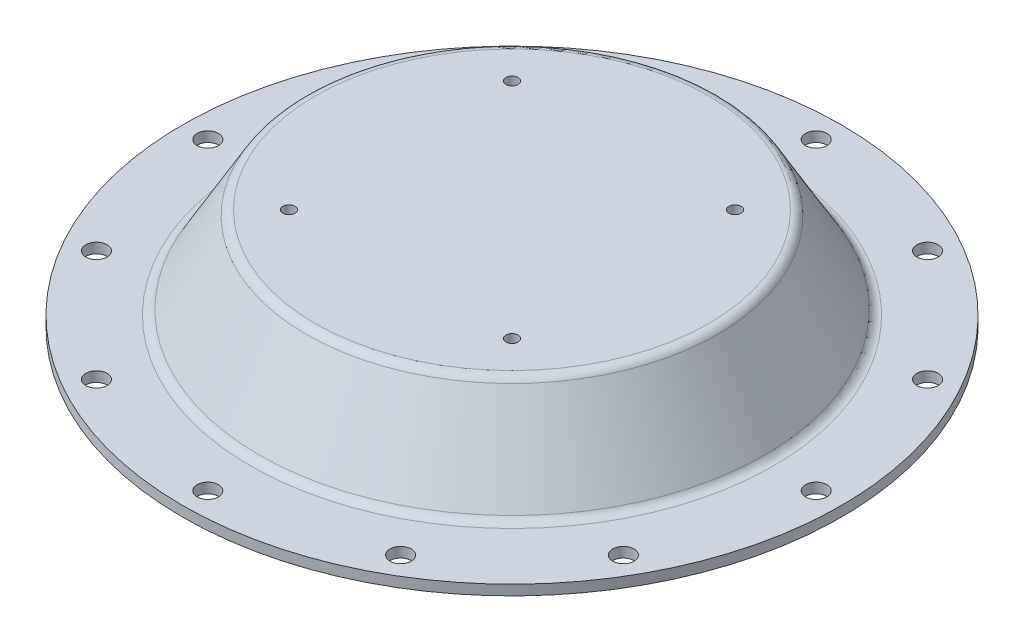
ISO-10303-21;
HEADER;
FILE_DESCRIPTION(('STEP AP214'),'2;1');
FILE_NAME('part.step','',(''),(''),'','','');
FILE_SCHEMA(('AUTOMOTIVE_DESIGN { 1 0 10303 214 1 1 1 1 }'));
ENDSEC;
DATA;
#1=APPLICATION_CONTEXT('core data for automotive mechanical design processes');
#2=APPLICATION_PROTOCOL_DEFINITION('international standard','automotive_design',2000,#1);
#3=PRODUCT_CONTEXT('',#1,'mechanical');
#4=PRODUCT('Part','Part','',(#3));
#5=PRODUCT_RELATED_PRODUCT_CATEGORY('part','',(#4));
#6=PRODUCT_DEFINITION_FORMATION('','',#4);
#7=PRODUCT_DEFINITION_CONTEXT('part definition',#1,'design');
#8=PRODUCT_DEFINITION('design','',#6,#7);
#9=PRODUCT_DEFINITION_SHAPE('','',#8);
#10=(LENGTH_UNIT() NAMED_UNIT(*) SI_UNIT(.MILLI.,.METRE.));
#11=(NAMED_UNIT(*) PLANE_ANGLE_UNIT() SI_UNIT($,.RADIAN.));
#12=(NAMED_UNIT(*) SI_UNIT($,.STERADIAN.) SOLID_ANGLE_UNIT());
#13=UNCERTAINTY_MEASURE_WITH_UNIT(LENGTH_MEASURE(1.E-05),#10,'distance_accuracy_value','');
#14=(GEOMETRIC_REPRESENTATION_CONTEXT(3) GLOBAL_UNCERTAINTY_ASSIGNED_CONTEXT((#13)) GLOBAL_UNIT_ASSIGNED_CONTEXT((#10,
#11,#12)) REPRESENTATION_CONTEXT('',''));
#15=CARTESIAN_POINT('',(0.,0.,0.));
#16=DIRECTION('',(0.,0.,1.));
#17=DIRECTION('',(1.,0.,0.));
#18=AXIS2_PLACEMENT_3D('',#15,#16,#17);
#19=CARTESIAN_POINT('',(0.,-90.,0.));
#20=DIRECTION('',(0.,-1.,0.));
#21=DIRECTION('',(0.,0.,-1.));
#22=AXIS2_PLACEMENT_3D('',#19,#20,#21);
#23=PLANE('',#22);
#24=CARTESIAN_POINT('',(-300.,-90.,0.));
#25=DIRECTION('',(0.,1.,0.));
#26=DIRECTION('',(0.,0.,1.));
#27=AXIS2_PLACEMENT_3D('',#24,#25,#26);
#28=CIRCLE('',#27,10.5);
#29=CARTESIAN_POINT('',(-300.,-90.,10.5));
#30=VERTEX_POINT('',#29);
#31=EDGE_CURVE('E142',#30,#30,#28,.T.);
#32=ORIENTED_EDGE('',*,*,#31,.F.);
#33=EDGE_LOOP('',(#32));
#34=FACE_BOUND('',#33,.T.);
#35=CARTESIAN_POINT('',(0.,-90.,0.));
#36=DIRECTION('',(0.,-1.,0.));
#37=DIRECTION('',(0.,0.,-1.));
#38=AXIS2_PLACEMENT_3D('',#35,#36,#37);
#39=CIRCLE('',#38,257.735026918963);
#40=CARTESIAN_POINT('',(0.,-90.,-257.735026918963));
#41=VERTEX_POINT('',#40);
#42=EDGE_CURVE('E48',#41,#41,#39,.T.);
#43=ORIENTED_EDGE('',*,*,#42,.T.);
#44=EDGE_LOOP('',(#43));
#45=FACE_BOUND('',#44,.T.);
#46=CARTESIAN_POINT('',(0.,-90.,0.));
#47=DIRECTION('',(0.,-1.,0.));
#48=DIRECTION('',(0.,0.,-1.));
#49=AXIS2_PLACEMENT_3D('',#46,#47,#48);
#50=CIRCLE('',#49,325.);
#51=CARTESIAN_POINT('',(0.,-90.,-325.));
#52=VERTEX_POINT('',#51);
#53=EDGE_CURVE('E73',#52,#52,#50,.T.);
#54=ORIENTED_EDGE('',*,*,#53,.F.);
#55=EDGE_LOOP('',(#54));
#56=FACE_BOUND('',#55,.T.);
#57=CARTESIAN_POINT('',(300.,-90.,0.));
#58=DIRECTION('',(0.,1.,0.));
#59=DIRECTION('',(0.,0.,1.));
#60=AXIS2_PLACEMENT_3D('',#57,#58,#59);
#61=CIRCLE('',#60,10.5);
#62=CARTESIAN_POINT('',(300.,-90.,10.5));
#63=VERTEX_POINT('',#62);
#64=EDGE_CURVE('E106',#63,#63,#61,.T.);
#65=ORIENTED_EDGE('',*,*,#64,.F.);
#66=EDGE_LOOP('',(#65));
#67=FACE_BOUND('',#66,.T.);
#68=CARTESIAN_POINT('',(259.807621135331,-90.,150.));
#69=DIRECTION('',(0.,1.,0.));
#70=DIRECTION('',(0.,0.,1.));
#71=AXIS2_PLACEMENT_3D('',#68,#69,#70);
#72=CIRCLE('',#71,10.5);
#73=CARTESIAN_POINT('',(259.807621135331,-90.,160.5));
#74=VERTEX_POINT('',#73);
#75=EDGE_CURVE('E112',#74,#74,#72,.T.);
#76=ORIENTED_EDGE('',*,*,#75,.F.);
#77=EDGE_LOOP('',(#76));
#78=FACE_BOUND('',#77,.T.);
#79=CARTESIAN_POINT('',(149.999999999999,-90.,259.807621135332));
#80=DIRECTION('',(0.,1.,0.));
#81=DIRECTION('',(0.,0.,1.));
#82=AXIS2_PLACEMENT_3D('',#79,#80,#81);
#83=CIRCLE('',#82,10.5);
#84=CARTESIAN_POINT('',(149.999999999999,-90.,270.307621135332));
#85=VERTEX_POINT('',#84);
#86=EDGE_CURVE('E118',#85,#85,#83,.T.);
#87=ORIENTED_EDGE('',*,*,#86,.F.);
#88=EDGE_LOOP('',(#87));
#89=FACE_BOUND('',#88,.T.);
#90=CARTESIAN_POINT('',(-1.04744440165294E-12,-90.,300.));
#91=DIRECTION('',(0.,1.,0.));
#92=DIRECTION('',(0.,0.,1.));
#93=AXIS2_PLACEMENT_3D('',#90,#91,#92);
#94=CIRCLE('',#93,10.5);
#95=CARTESIAN_POINT('',(-1.04744440165294E-12,-90.,310.5));
#96=VERTEX_POINT('',#95);
#97=EDGE_CURVE('E124',#96,#96,#94,.T.);
#98=ORIENTED_EDGE('',*,*,#97,.F.);
#99=EDGE_LOOP('',(#98));
#100=FACE_BOUND('',#99,.T.);
#101=CARTESIAN_POINT('',(-150.000000000001,-90.,259.807621135331));
#102=DIRECTION('',(0.,1.,0.));
#103=DIRECTION('',(0.,0.,1.));
#104=AXIS2_PLACEMENT_3D('',#101,#102,#103);
#105=CIRCLE('',#104,10.5);
#106=CARTESIAN_POINT('',(-150.000000000001,-90.,270.307621135331));
#107=VERTEX_POINT('',#106);
#108=EDGE_CURVE('E130',#107,#107,#105,.T.);
#109=ORIENTED_EDGE('',*,*,#108,.F.);
#110=EDGE_LOOP('',(#109));
#111=FACE_BOUND('',#110,.T.);
#112=CARTESIAN_POINT('',(-259.807621135332,-90.,149.999999999998));
#113=DIRECTION('',(0.,1.,0.));
#114=DIRECTION('',(0.,0.,1.));
#115=AXIS2_PLACEMENT_3D('',#112,#113,#114);
#116=CIRCLE('',#115,10.5);
#117=CARTESIAN_POINT('',(-259.807621135332,-90.,160.499999999998));
#118=VERTEX_POINT('',#117);
#119=EDGE_CURVE('E136',#118,#118,#116,.T.);
#120=ORIENTED_EDGE('',*,*,#119,.F.);
#121=EDGE_LOOP('',(#120));
#122=FACE_BOUND('',#121,.T.);
#123=CARTESIAN_POINT('',(-259.80762113533,-90.,-150.000000000002));
#124=DIRECTION('',(0.,1.,0.));
#125=DIRECTION('',(0.,0.,1.));
#126=AXIS2_PLACEMENT_3D('',#123,#124,#125);
#127=CIRCLE('',#126,10.5);
#128=CARTESIAN_POINT('',(-259.80762113533,-90.,-139.500000000002));
#129=VERTEX_POINT('',#128);
#130=EDGE_CURVE('E148',#129,#129,#127,.T.);
#131=ORIENTED_EDGE('',*,*,#130,.F.);
#132=EDGE_LOOP('',(#131));
#133=FACE_BOUND('',#132,.T.);
#134=CARTESIAN_POINT('',(-149.999999999998,-90.,-259.807621135333));
#135=DIRECTION('',(0.,1.,0.));
#136=DIRECTION('',(0.,0.,1.));
#137=AXIS2_PLACEMENT_3D('',#134,#135,#136);
#138=CIRCLE('',#137,10.5);
#139=CARTESIAN_POINT('',(-149.999999999998,-90.,-249.307621135333));
#140=VERTEX_POINT('',#139);
#141=EDGE_CURVE('E154',#140,#140,#138,.T.);
#142=ORIENTED_EDGE('',*,*,#141,.F.);
#143=EDGE_LOOP('',(#142));
#144=FACE_BOUND('',#143,.T.);
#145=CARTESIAN_POINT('',(3.14233320495882E-12,-90.,-300.));
#146=DIRECTION('',(0.,1.,0.));
#147=DIRECTION('',(0.,0.,1.));
#148=AXIS2_PLACEMENT_3D('',#145,#146,#147);
#149=CIRCLE('',#148,10.5);
#150=CARTESIAN_POINT('',(3.14233320495882E-12,-90.,-289.5));
#151=VERTEX_POINT('',#150);
#152=EDGE_CURVE('E160',#151,#151,#149,.T.);
#153=ORIENTED_EDGE('',*,*,#152,.F.);
#154=EDGE_LOOP('',(#153));
#155=FACE_BOUND('',#154,.T.);
#156=CARTESIAN_POINT('',(150.000000000003,-90.,-259.80762113533));
#157=DIRECTION('',(0.,1.,0.));
#158=DIRECTION('',(0.,0.,1.));
#159=AXIS2_PLACEMENT_3D('',#156,#157,#158);
#160=CIRCLE('',#159,10.5);
#161=CARTESIAN_POINT('',(150.000000000003,-90.,-249.30762113533));
#162=VERTEX_POINT('',#161);
#163=EDGE_CURVE('E166',#162,#162,#160,.T.);
#164=ORIENTED_EDGE('',*,*,#163,.F.);
#165=EDGE_LOOP('',(#164));
#166=FACE_BOUND('',#165,.T.);
#167=CARTESIAN_POINT('',(259.807621135334,-90.,-149.999999999997));
#168=DIRECTION('',(0.,1.,0.));
#169=DIRECTION('',(0.,0.,1.));
#170=AXIS2_PLACEMENT_3D('',#167,#168,#169);
#171=CIRCLE('',#170,10.5);
#172=CARTESIAN_POINT('',(259.807621135334,-90.,-139.499999999997));
#173=VERTEX_POINT('',#172);
#174=EDGE_CURVE('E172',#173,#173,#171,.T.);
#175=ORIENTED_EDGE('',*,*,#174,.F.);
#176=EDGE_LOOP('',(#175));
#177=FACE_BOUND('',#176,.T.);
#178=ADVANCED_FACE('F41',(#34,#45,#56,#67,#78,#89,#100,#111,#122,#133,#144,#155,#166,#177),#23,.F.);
#179=CARTESIAN_POINT('',(0.,0.,0.));
#180=DIRECTION('',(0.,-1.,0.));
#181=DIRECTION('',(0.,0.,1.));
#182=AXIS2_PLACEMENT_3D('',#179,#180,#181);
#183=CONICAL_SURFACE('',#182,200.,0.5235987755983);
#184=CARTESIAN_POINT('',(0.,-85.,0.));
#185=DIRECTION('',(0.,1.,0.));
#186=DIRECTION('',(0.,0.,1.));
#187=AXIS2_PLACEMENT_3D('',#184,#185,#186);
#188=CIRCLE('',#187,249.074772881118);
#189=CARTESIAN_POINT('',(0.,-85.,249.074772881118));
#190=VERTEX_POINT('',#189);
#191=EDGE_CURVE('E52',#190,#190,#188,.T.);
#192=ORIENTED_EDGE('',*,*,#191,.T.);
#193=EDGE_LOOP('',(#192));
#194=FACE_BOUND('',#193,.T.);
#195=CARTESIAN_POINT('',(0.,-5.,0.));
#196=DIRECTION('',(0.,1.,0.));
#197=DIRECTION('',(0.,0.,1.));
#198=AXIS2_PLACEMENT_3D('',#195,#196,#197);
#199=CIRCLE('',#198,202.886751345948);
#200=CARTESIAN_POINT('',(0.,-5.,202.886751345948));
#201=VERTEX_POINT('',#200);
#202=EDGE_CURVE('E56',#201,#201,#199,.F.);
#203=ORIENTED_EDGE('',*,*,#202,.T.);
#204=EDGE_LOOP('',(#203));
#205=FACE_BOUND('',#204,.T.);
#206=ADVANCED_FACE('F179',(#194,#205),#183,.T.);
#207=CARTESIAN_POINT('',(0.,0.,0.));
#208=DIRECTION('',(0.,1.,0.));
#209=DIRECTION('',(0.,0.,1.));
#210=AXIS2_PLACEMENT_3D('',#207,#208,#209);
#211=PLANE('',#210);
#212=CARTESIAN_POINT('',(110.,0.,-110.));
#213=DIRECTION('',(0.,1.,0.));
#214=DIRECTION('',(0.,0.,1.));
#215=AXIS2_PLACEMENT_3D('',#212,#213,#214);
#216=CIRCLE('',#215,5.99999999999998);
#217=CARTESIAN_POINT('',(110.,0.,-104.));
#218=VERTEX_POINT('',#217);
#219=EDGE_CURVE('E100',#218,#218,#216,.T.);
#220=ORIENTED_EDGE('',*,*,#219,.F.);
#221=EDGE_LOOP('',(#220));
#222=FACE_BOUND('',#221,.T.);
#223=CARTESIAN_POINT('',(-110.,0.,110.));
#224=DIRECTION('',(0.,1.,0.));
#225=DIRECTION('',(0.,0.,1.));
#226=AXIS2_PLACEMENT_3D('',#223,#224,#225);
#227=CIRCLE('',#226,5.99999999999998);
#228=CARTESIAN_POINT('',(-110.,0.,116.));
#229=VERTEX_POINT('',#228);
#230=EDGE_CURVE('E94',#229,#229,#227,.T.);
#231=ORIENTED_EDGE('',*,*,#230,.F.);
#232=EDGE_LOOP('',(#231));
#233=FACE_BOUND('',#232,.T.);
#234=CARTESIAN_POINT('',(-110.,0.,-110.));
#235=DIRECTION('',(0.,1.,0.));
#236=DIRECTION('',(0.,0.,1.));
#237=AXIS2_PLACEMENT_3D('',#234,#235,#236);
#238=CIRCLE('',#237,5.99999999999998);
#239=CARTESIAN_POINT('',(-110.,0.,-104.));
#240=VERTEX_POINT('',#239);
#241=EDGE_CURVE('E88',#240,#240,#238,.T.);
#242=ORIENTED_EDGE('',*,*,#241,.F.);
#243=EDGE_LOOP('',(#242));
#244=FACE_BOUND('',#243,.T.);
#245=CARTESIAN_POINT('',(110.,0.,110.));
#246=DIRECTION('',(0.,1.,0.));
#247=DIRECTION('',(0.,0.,1.));
#248=AXIS2_PLACEMENT_3D('',#245,#246,#247);
#249=CIRCLE('',#248,5.99999999999998);
#250=CARTESIAN_POINT('',(110.,0.,116.));
#251=VERTEX_POINT('',#250);
#252=EDGE_CURVE('E82',#251,#251,#249,.T.);
#253=ORIENTED_EDGE('',*,*,#252,.F.);
#254=EDGE_LOOP('',(#253));
#255=FACE_BOUND('',#254,.T.);
#256=CARTESIAN_POINT('',(0.,0.,0.));
#257=DIRECTION('',(0.,1.,0.));
#258=DIRECTION('',(0.,0.,1.));
#259=AXIS2_PLACEMENT_3D('',#256,#257,#258);
#260=CIRCLE('',#259,194.226497308104);
#261=CARTESIAN_POINT('',(0.,0.,194.226497308104));
#262=VERTEX_POINT('',#261);
#263=EDGE_CURVE('E10',#262,#262,#260,.T.);
#264=ORIENTED_EDGE('',*,*,#263,.T.);
#265=EDGE_LOOP('',(#264));
#266=FACE_BOUND('',#265,.T.);
#267=ADVANCED_FACE('F186',(#222,#233,#244,#255,#266),#211,.T.);
#268=CARTESIAN_POINT('',(0.,-90.,0.));
#269=DIRECTION('',(0.,-1.,0.));
#270=DIRECTION('',(0.,0.,-1.));
#271=AXIS2_PLACEMENT_3D('',#268,#269,#270);
#272=CYLINDRICAL_SURFACE('',#271,325.);
#273=ORIENTED_EDGE('',*,*,#53,.T.);
#274=EDGE_LOOP('',(#273));
#275=FACE_BOUND('',#274,.T.);
#276=CARTESIAN_POINT('',(0.,-100.,0.));
#277=DIRECTION('',(0.,-1.,0.));
#278=DIRECTION('',(0.,0.,-1.));
#279=AXIS2_PLACEMENT_3D('',#276,#277,#278);
#280=CIRCLE('',#279,325.);
#281=CARTESIAN_POINT('',(0.,-100.,-325.));
#282=VERTEX_POINT('',#281);
#283=EDGE_CURVE('E74',#282,#282,#280,.T.);
#284=ORIENTED_EDGE('',*,*,#283,.F.);
#285=EDGE_LOOP('',(#284));
#286=FACE_BOUND('',#285,.T.);
#287=ADVANCED_FACE('F194',(#275,#286),#272,.T.);
#288=CARTESIAN_POINT('',(0.,-100.,0.));
#289=DIRECTION('',(0.,1.,0.));
#290=DIRECTION('',(0.,0.,1.));
#291=AXIS2_PLACEMENT_3D('',#288,#289,#290);
#292=PLANE('',#291);
#293=CARTESIAN_POINT('',(259.807621135334,-100.,-149.999999999997));
#294=DIRECTION('',(0.,1.,0.));
#295=DIRECTION('',(0.,0.,1.));
#296=AXIS2_PLACEMENT_3D('',#293,#294,#295);
#297=CIRCLE('',#296,10.5);
#298=CARTESIAN_POINT('',(259.807621135334,-100.,-139.499999999997));
#299=VERTEX_POINT('',#298);
#300=EDGE_CURVE('E169',#299,#299,#297,.T.);
#301=ORIENTED_EDGE('',*,*,#300,.T.);
#302=EDGE_LOOP('',(#301));
#303=FACE_BOUND('',#302,.T.);
#304=CARTESIAN_POINT('',(150.000000000003,-100.,-259.80762113533));
#305=DIRECTION('',(0.,1.,0.));
#306=DIRECTION('',(0.,0.,1.));
#307=AXIS2_PLACEMENT_3D('',#304,#305,#306);
#308=CIRCLE('',#307,10.5);
#309=CARTESIAN_POINT('',(150.000000000003,-100.,-249.30762113533));
#310=VERTEX_POINT('',#309);
#311=EDGE_CURVE('E163',#310,#310,#308,.T.);
#312=ORIENTED_EDGE('',*,*,#311,.T.);
#313=EDGE_LOOP('',(#312));
#314=FACE_BOUND('',#313,.T.);
#315=CARTESIAN_POINT('',(3.14233320495882E-12,-100.,-300.));
#316=DIRECTION('',(0.,1.,0.));
#317=DIRECTION('',(0.,0.,1.));
#318=AXIS2_PLACEMENT_3D('',#315,#316,#317);
#319=CIRCLE('',#318,10.5);
#320=CARTESIAN_POINT('',(3.14233320495882E-12,-100.,-289.5));
#321=VERTEX_POINT('',#320);
#322=EDGE_CURVE('E157',#321,#321,#319,.T.);
#323=ORIENTED_EDGE('',*,*,#322,.T.);
#324=EDGE_LOOP('',(#323));
#325=FACE_BOUND('',#324,.T.);
#326=CARTESIAN_POINT('',(-149.999999999998,-100.,-259.807621135333));
#327=DIRECTION('',(0.,1.,0.));
#328=DIRECTION('',(0.,0.,1.));
#329=AXIS2_PLACEMENT_3D('',#326,#327,#328);
#330=CIRCLE('',#329,10.5);
#331=CARTESIAN_POINT('',(-149.999999999998,-100.,-249.307621135333));
#332=VERTEX_POINT('',#331);
#333=EDGE_CURVE('E151',#332,#332,#330,.T.);
#334=ORIENTED_EDGE('',*,*,#333,.T.);
#335=EDGE_LOOP('',(#334));
#336=FACE_BOUND('',#335,.T.);
#337=CARTESIAN_POINT('',(-259.80762113533,-100.,-150.000000000002));
#338=DIRECTION('',(0.,1.,0.));
#339=DIRECTION('',(0.,0.,1.));
#340=AXIS2_PLACEMENT_3D('',#337,#338,#339);
#341=CIRCLE('',#340,10.5);
#342=CARTESIAN_POINT('',(-259.80762113533,-100.,-139.500000000002));
#343=VERTEX_POINT('',#342);
#344=EDGE_CURVE('E145',#343,#343,#341,.T.);
#345=ORIENTED_EDGE('',*,*,#344,.T.);
#346=EDGE_LOOP('',(#345));
#347=FACE_BOUND('',#346,.T.);
#348=CARTESIAN_POINT('',(-300.,-100.,0.));
#349=DIRECTION('',(0.,1.,0.));
#350=DIRECTION('',(0.,0.,1.));
#351=AXIS2_PLACEMENT_3D('',#348,#349,#350);
#352=CIRCLE('',#351,10.5);
#353=CARTESIAN_POINT('',(-300.,-100.,10.5));
#354=VERTEX_POINT('',#353);
#355=EDGE_CURVE('E139',#354,#354,#352,.T.);
#356=ORIENTED_EDGE('',*,*,#355,.T.);
#357=EDGE_LOOP('',(#356));
#358=FACE_BOUND('',#357,.T.);
#359=CARTESIAN_POINT('',(-259.807621135332,-100.,149.999999999998));
#360=DIRECTION('',(0.,1.,0.));
#361=DIRECTION('',(0.,0.,1.));
#362=AXIS2_PLACEMENT_3D('',#359,#360,#361);
#363=CIRCLE('',#362,10.5);
#364=CARTESIAN_POINT('',(-259.807621135332,-100.,160.499999999998));
#365=VERTEX_POINT('',#364);
#366=EDGE_CURVE('E133',#365,#365,#363,.T.);
#367=ORIENTED_EDGE('',*,*,#366,.T.);
#368=EDGE_LOOP('',(#367));
#369=FACE_BOUND('',#368,.T.);
#370=CARTESIAN_POINT('',(-150.000000000001,-100.,259.807621135331));
#371=DIRECTION('',(0.,1.,0.));
#372=DIRECTION('',(0.,0.,1.));
#373=AXIS2_PLACEMENT_3D('',#370,#371,#372);
#374=CIRCLE('',#373,10.5);
#375=CARTESIAN_POINT('',(-150.000000000001,-100.,270.307621135331));
#376=VERTEX_POINT('',#375);
#377=EDGE_CURVE('E127',#376,#376,#374,.T.);
#378=ORIENTED_EDGE('',*,*,#377,.T.);
#379=EDGE_LOOP('',(#378));
#380=FACE_BOUND('',#379,.T.);
#381=CARTESIAN_POINT('',(-1.04744440165294E-12,-100.,300.));
#382=DIRECTION('',(0.,1.,0.));
#383=DIRECTION('',(0.,0.,1.));
#384=AXIS2_PLACEMENT_3D('',#381,#382,#383);
#385=CIRCLE('',#384,10.5);
#386=CARTESIAN_POINT('',(-1.04744440165294E-12,-100.,310.5));
#387=VERTEX_POINT('',#386);
#388=EDGE_CURVE('E121',#387,#387,#385,.T.);
#389=ORIENTED_EDGE('',*,*,#388,.T.);
#390=EDGE_LOOP('',(#389));
#391=FACE_BOUND('',#390,.T.);
#392=CARTESIAN_POINT('',(149.999999999999,-100.,259.807621135332));
#393=DIRECTION('',(0.,1.,0.));
#394=DIRECTION('',(0.,0.,1.));
#395=AXIS2_PLACEMENT_3D('',#392,#393,#394);
#396=CIRCLE('',#395,10.5);
#397=CARTESIAN_POINT('',(149.999999999999,-100.,270.307621135332));
#398=VERTEX_POINT('',#397);
#399=EDGE_CURVE('E115',#398,#398,#396,.T.);
#400=ORIENTED_EDGE('',*,*,#399,.T.);
#401=EDGE_LOOP('',(#400));
#402=FACE_BOUND('',#401,.T.);
#403=CARTESIAN_POINT('',(259.807621135331,-100.,150.));
#404=DIRECTION('',(0.,1.,0.));
#405=DIRECTION('',(0.,0.,1.));
#406=AXIS2_PLACEMENT_3D('',#403,#404,#405);
#407=CIRCLE('',#406,10.5);
#408=CARTESIAN_POINT('',(259.807621135331,-100.,160.5));
#409=VERTEX_POINT('',#408);
#410=EDGE_CURVE('E109',#409,#409,#407,.T.);
#411=ORIENTED_EDGE('',*,*,#410,.T.);
#412=EDGE_LOOP('',(#411));
#413=FACE_BOUND('',#412,.T.);
#414=CARTESIAN_POINT('',(300.,-100.,0.));
#415=DIRECTION('',(0.,1.,0.));
#416=DIRECTION('',(0.,0.,1.));
#417=AXIS2_PLACEMENT_3D('',#414,#415,#416);
#418=CIRCLE('',#417,10.5);
#419=CARTESIAN_POINT('',(300.,-100.,10.5));
#420=VERTEX_POINT('',#419);
#421=EDGE_CURVE('E103',#420,#420,#418,.T.);
#422=ORIENTED_EDGE('',*,*,#421,.T.);
#423=EDGE_LOOP('',(#422));
#424=FACE_BOUND('',#423,.T.);
#425=CARTESIAN_POINT('',(0.,-100.,0.));
#426=DIRECTION('',(0.,1.,0.));
#427=DIRECTION('',(0.,0.,1.));
#428=AXIS2_PLACEMENT_3D('',#425,#426,#427);
#429=CIRCLE('',#428,251.961524227066);
#430=CARTESIAN_POINT('',(0.,-100.,251.961524227066));
#431=VERTEX_POINT('',#430);
#432=EDGE_CURVE('E61',#431,#431,#429,.T.);
#433=ORIENTED_EDGE('',*,*,#432,.T.);
#434=EDGE_LOOP('',(#433));
#435=FACE_BOUND('',#434,.T.);
#436=ORIENTED_EDGE('',*,*,#283,.T.);
#437=EDGE_LOOP('',(#436));
#438=FACE_BOUND('',#437,.T.);
#439=ADVANCED_FACE('F197',(#303,#314,#325,#336,#347,#358,#369,#380,#391,#402,#413,#424,#435,
#438),#292,.F.);
#440=CARTESIAN_POINT('',(0.,-5.00000000000001,0.));
#441=DIRECTION('',(0.,-1.,0.));
#442=DIRECTION('',(0.,0.,1.));
#443=AXIS2_PLACEMENT_3D('',#440,#441,#442);
#444=CONICAL_SURFACE('',#443,191.339745962156,0.5235987755983);
#445=CARTESIAN_POINT('',(0.,-15.,0.));
#446=DIRECTION('',(0.,-1.,0.));
#447=DIRECTION('',(0.,0.,-1.));
#448=AXIS2_PLACEMENT_3D('',#445,#446,#447);
#449=CIRCLE('',#448,197.113248654052);
#450=CARTESIAN_POINT('',(0.,-15.,-197.113248654052));
#451=VERTEX_POINT('',#450);
#452=EDGE_CURVE('E67',#451,#451,#449,.F.);
#453=ORIENTED_EDGE('',*,*,#452,.T.);
#454=EDGE_LOOP('',(#453));
#455=FACE_BOUND('',#454,.T.);
#456=CARTESIAN_POINT('',(0.,-94.9999999999999,0.));
#457=DIRECTION('',(0.,1.,0.));
#458=DIRECTION('',(0.,0.,1.));
#459=AXIS2_PLACEMENT_3D('',#456,#457,#458);
#460=CIRCLE('',#459,243.301270189222);
#461=CARTESIAN_POINT('',(0.,-94.9999999999999,243.301270189222));
#462=VERTEX_POINT('',#461);
#463=EDGE_CURVE('E70',#462,#462,#460,.F.);
#464=ORIENTED_EDGE('',*,*,#463,.T.);
#465=EDGE_LOOP('',(#464));
#466=FACE_BOUND('',#465,.T.);
#467=ADVANCED_FACE('F201',(#455,#466),#444,.F.);
#468=CARTESIAN_POINT('',(0.,-10.,0.));
#469=DIRECTION('',(0.,1.,0.));
#470=DIRECTION('',(0.,0.,1.));
#471=AXIS2_PLACEMENT_3D('',#468,#469,#470);
#472=PLANE('',#471);
#473=CARTESIAN_POINT('',(110.,-9.99999999999999,-110.));
#474=DIRECTION('',(0.,1.,0.));
#475=DIRECTION('',(0.,0.,1.));
#476=AXIS2_PLACEMENT_3D('',#473,#474,#475);
#477=CIRCLE('',#476,5.99999999999998);
#478=CARTESIAN_POINT('',(110.,-9.99999999999999,-104.));
#479=VERTEX_POINT('',#478);
#480=EDGE_CURVE('E97',#479,#479,#477,.T.);
#481=ORIENTED_EDGE('',*,*,#480,.T.);
#482=EDGE_LOOP('',(#481));
#483=FACE_BOUND('',#482,.T.);
#484=CARTESIAN_POINT('',(-110.,-9.99999999999999,110.));
#485=DIRECTION('',(0.,1.,0.));
#486=DIRECTION('',(0.,0.,1.));
#487=AXIS2_PLACEMENT_3D('',#484,#485,#486);
#488=CIRCLE('',#487,5.99999999999998);
#489=CARTESIAN_POINT('',(-110.,-9.99999999999999,116.));
#490=VERTEX_POINT('',#489);
#491=EDGE_CURVE('E91',#490,#490,#488,.T.);
#492=ORIENTED_EDGE('',*,*,#491,.T.);
#493=EDGE_LOOP('',(#492));
#494=FACE_BOUND('',#493,.T.);
#495=CARTESIAN_POINT('',(-110.,-9.99999999999999,-110.));
#496=DIRECTION('',(0.,1.,0.));
#497=DIRECTION('',(0.,0.,1.));
#498=AXIS2_PLACEMENT_3D('',#495,#496,#497);
#499=CIRCLE('',#498,5.99999999999998);
#500=CARTESIAN_POINT('',(-110.,-9.99999999999999,-104.));
#501=VERTEX_POINT('',#500);
#502=EDGE_CURVE('E85',#501,#501,#499,.T.);
#503=ORIENTED_EDGE('',*,*,#502,.T.);
#504=EDGE_LOOP('',(#503));
#505=FACE_BOUND('',#504,.T.);
#506=CARTESIAN_POINT('',(110.,-9.99999999999999,110.));
#507=DIRECTION('',(0.,1.,0.));
#508=DIRECTION('',(0.,0.,1.));
#509=AXIS2_PLACEMENT_3D('',#506,#507,#508);
#510=CIRCLE('',#509,5.99999999999998);
#511=CARTESIAN_POINT('',(110.,-9.99999999999999,116.));
#512=VERTEX_POINT('',#511);
#513=EDGE_CURVE('E77',#512,#512,#510,.T.);
#514=ORIENTED_EDGE('',*,*,#513,.T.);
#515=EDGE_LOOP('',(#514));
#516=FACE_BOUND('',#515,.T.);
#517=CARTESIAN_POINT('',(0.,-10.,0.));
#518=DIRECTION('',(0.,1.,0.));
#519=DIRECTION('',(0.,0.,1.));
#520=AXIS2_PLACEMENT_3D('',#517,#518,#519);
#521=CIRCLE('',#520,188.452994616208);
#522=CARTESIAN_POINT('',(0.,-10.,188.452994616208));
#523=VERTEX_POINT('',#522);
#524=EDGE_CURVE('E64',#523,#523,#521,.F.);
#525=ORIENTED_EDGE('',*,*,#524,.T.);
#526=EDGE_LOOP('',(#525));
#527=FACE_BOUND('',#526,.T.);
#528=ADVANCED_FACE('F192',(#483,#494,#505,#516,#527),#472,.F.);
#529=CARTESIAN_POINT('',(0.,-20.,0.));
#530=DIRECTION('',(0.,1.,0.));
#531=DIRECTION('',(0.,0.,1.));
#532=AXIS2_PLACEMENT_3D('',#529,#530,#531);
#533=TOROIDAL_SURFACE('',#532,188.452994616208,10.);
#534=ORIENTED_EDGE('',*,*,#524,.F.);
#535=EDGE_LOOP('',(#534));
#536=FACE_BOUND('',#535,.T.);
#537=ORIENTED_EDGE('',*,*,#452,.F.);
#538=EDGE_LOOP('',(#537));
#539=FACE_BOUND('',#538,.T.);
#540=ADVANCED_FACE('F206',(#536,#539),#533,.F.);
#541=CARTESIAN_POINT('',(0.,-90.,0.));
#542=DIRECTION('',(0.,1.,0.));
#543=DIRECTION('',(0.,0.,1.));
#544=AXIS2_PLACEMENT_3D('',#541,#542,#543);
#545=TOROIDAL_SURFACE('',#544,251.961524227066,10.);
#546=ORIENTED_EDGE('',*,*,#463,.F.);
#547=EDGE_LOOP('',(#546));
#548=FACE_BOUND('',#547,.T.);
#549=ORIENTED_EDGE('',*,*,#432,.F.);
#550=EDGE_LOOP('',(#549));
#551=FACE_BOUND('',#550,.T.);
#552=ADVANCED_FACE('F209',(#548,#551),#545,.T.);
#553=CARTESIAN_POINT('',(0.,-80.,0.));
#554=DIRECTION('',(0.,-1.,0.));
#555=DIRECTION('',(0.,0.,-1.));
#556=AXIS2_PLACEMENT_3D('',#553,#554,#555);
#557=TOROIDAL_SURFACE('',#556,257.735026918963,10.);
#558=ORIENTED_EDGE('',*,*,#42,.F.);
#559=EDGE_LOOP('',(#558));
#560=FACE_BOUND('',#559,.T.);
#561=ORIENTED_EDGE('',*,*,#191,.F.);
#562=EDGE_LOOP('',(#561));
#563=FACE_BOUND('',#562,.T.);
#564=ADVANCED_FACE('F212',(#560,#563),#557,.F.);
#565=CARTESIAN_POINT('',(0.,-10.,0.));
#566=DIRECTION('',(0.,1.,0.));
#567=DIRECTION('',(0.,0.,1.));
#568=AXIS2_PLACEMENT_3D('',#565,#566,#567);
#569=TOROIDAL_SURFACE('',#568,194.226497308104,10.);
#570=ORIENTED_EDGE('',*,*,#202,.F.);
#571=EDGE_LOOP('',(#570));
#572=FACE_BOUND('',#571,.T.);
#573=ORIENTED_EDGE('',*,*,#263,.F.);
#574=EDGE_LOOP('',(#573));
#575=FACE_BOUND('',#574,.T.);
#576=ADVANCED_FACE('F43',(#572,#575),#569,.T.);
#577=CARTESIAN_POINT('',(110.,-100.,110.));
#578=DIRECTION('',(0.,-1.,0.));
#579=DIRECTION('',(0.,0.,-1.));
#580=AXIS2_PLACEMENT_3D('',#577,#578,#579);
#581=CYLINDRICAL_SURFACE('',#580,5.99999999999998);
#582=ORIENTED_EDGE('',*,*,#252,.T.);
#583=EDGE_LOOP('',(#582));
#584=FACE_BOUND('',#583,.T.);
#585=ORIENTED_EDGE('',*,*,#513,.F.);
#586=EDGE_LOOP('',(#585));
#587=FACE_BOUND('',#586,.T.);
#588=ADVANCED_FACE('F219',(#584,#587),#581,.F.);
#589=CARTESIAN_POINT('',(-110.,-100.,-110.));
#590=DIRECTION('',(0.,-1.,0.));
#591=DIRECTION('',(0.,0.,-1.));
#592=AXIS2_PLACEMENT_3D('',#589,#590,#591);
#593=CYLINDRICAL_SURFACE('',#592,5.99999999999998);
#594=ORIENTED_EDGE('',*,*,#241,.T.);
#595=EDGE_LOOP('',(#594));
#596=FACE_BOUND('',#595,.T.);
#597=ORIENTED_EDGE('',*,*,#502,.F.);
#598=EDGE_LOOP('',(#597));
#599=FACE_BOUND('',#598,.T.);
#600=ADVANCED_FACE('F229',(#596,#599),#593,.F.);
#601=CARTESIAN_POINT('',(-110.,-100.,110.));
#602=DIRECTION('',(0.,-1.,0.));
#603=DIRECTION('',(0.,0.,-1.));
#604=AXIS2_PLACEMENT_3D('',#601,#602,#603);
#605=CYLINDRICAL_SURFACE('',#604,5.99999999999998);
#606=ORIENTED_EDGE('',*,*,#230,.T.);
#607=EDGE_LOOP('',(#606));
#608=FACE_BOUND('',#607,.T.);
#609=ORIENTED_EDGE('',*,*,#491,.F.);
#610=EDGE_LOOP('',(#609));
#611=FACE_BOUND('',#610,.T.);
#612=ADVANCED_FACE('F236',(#608,#611),#605,.F.);
#613=CARTESIAN_POINT('',(110.,-100.,-110.));
#614=DIRECTION('',(0.,-1.,0.));
#615=DIRECTION('',(0.,0.,-1.));
#616=AXIS2_PLACEMENT_3D('',#613,#614,#615);
#617=CYLINDRICAL_SURFACE('',#616,5.99999999999998);
#618=ORIENTED_EDGE('',*,*,#219,.T.);
#619=EDGE_LOOP('',(#618));
#620=FACE_BOUND('',#619,.T.);
#621=ORIENTED_EDGE('',*,*,#480,.F.);
#622=EDGE_LOOP('',(#621));
#623=FACE_BOUND('',#622,.T.);
#624=ADVANCED_FACE('F272',(#620,#623),#617,.F.);
#625=CARTESIAN_POINT('',(300.,-90.,0.));
#626=DIRECTION('',(0.,1.,0.));
#627=DIRECTION('',(0.,0.,1.));
#628=AXIS2_PLACEMENT_3D('',#625,#626,#627);
#629=CYLINDRICAL_SURFACE('',#628,10.5);
#630=ORIENTED_EDGE('',*,*,#421,.F.);
#631=EDGE_LOOP('',(#630));
#632=FACE_BOUND('',#631,.T.);
#633=ORIENTED_EDGE('',*,*,#64,.T.);
#634=EDGE_LOOP('',(#633));
#635=FACE_BOUND('',#634,.T.);
#636=ADVANCED_FACE('F277',(#632,#635),#629,.F.);
#637=CARTESIAN_POINT('',(259.807621135331,-90.,150.));
#638=DIRECTION('',(0.,1.,0.));
#639=DIRECTION('',(0.,0.,1.));
#640=AXIS2_PLACEMENT_3D('',#637,#638,#639);
#641=CYLINDRICAL_SURFACE('',#640,10.5);
#642=ORIENTED_EDGE('',*,*,#410,.F.);
#643=EDGE_LOOP('',(#642));
#644=FACE_BOUND('',#643,.T.);
#645=ORIENTED_EDGE('',*,*,#75,.T.);
#646=EDGE_LOOP('',(#645));
#647=FACE_BOUND('',#646,.T.);
#648=ADVANCED_FACE('F283',(#644,#647),#641,.F.);
#649=CARTESIAN_POINT('',(149.999999999999,-90.,259.807621135332));
#650=DIRECTION('',(0.,1.,0.));
#651=DIRECTION('',(0.,0.,1.));
#652=AXIS2_PLACEMENT_3D('',#649,#650,#651);
#653=CYLINDRICAL_SURFACE('',#652,10.5);
#654=ORIENTED_EDGE('',*,*,#399,.F.);
#655=EDGE_LOOP('',(#654));
#656=FACE_BOUND('',#655,.T.);
#657=ORIENTED_EDGE('',*,*,#86,.T.);
#658=EDGE_LOOP('',(#657));
#659=FACE_BOUND('',#658,.T.);
#660=ADVANCED_FACE('F287',(#656,#659),#653,.F.);
#661=CARTESIAN_POINT('',(-1.04744440165294E-12,-90.,300.));
#662=DIRECTION('',(0.,1.,0.));
#663=DIRECTION('',(0.,0.,1.));
#664=AXIS2_PLACEMENT_3D('',#661,#662,#663);
#665=CYLINDRICAL_SURFACE('',#664,10.5);
#666=ORIENTED_EDGE('',*,*,#388,.F.);
#667=EDGE_LOOP('',(#666));
#668=FACE_BOUND('',#667,.T.);
#669=ORIENTED_EDGE('',*,*,#97,.T.);
#670=EDGE_LOOP('',(#669));
#671=FACE_BOUND('',#670,.T.);
#672=ADVANCED_FACE('F291',(#668,#671),#665,.F.);
#673=CARTESIAN_POINT('',(-150.000000000001,-90.,259.807621135331));
#674=DIRECTION('',(0.,1.,0.));
#675=DIRECTION('',(0.,0.,1.));
#676=AXIS2_PLACEMENT_3D('',#673,#674,#675);
#677=CYLINDRICAL_SURFACE('',#676,10.5);
#678=ORIENTED_EDGE('',*,*,#377,.F.);
#679=EDGE_LOOP('',(#678));
#680=FACE_BOUND('',#679,.T.);
#681=ORIENTED_EDGE('',*,*,#108,.T.);
#682=EDGE_LOOP('',(#681));
#683=FACE_BOUND('',#682,.T.);
#684=ADVANCED_FACE('F295',(#680,#683),#677,.F.);
#685=CARTESIAN_POINT('',(-259.807621135332,-90.,149.999999999998));
#686=DIRECTION('',(0.,1.,0.));
#687=DIRECTION('',(0.,0.,1.));
#688=AXIS2_PLACEMENT_3D('',#685,#686,#687);
#689=CYLINDRICAL_SURFACE('',#688,10.5);
#690=ORIENTED_EDGE('',*,*,#366,.F.);
#691=EDGE_LOOP('',(#690));
#692=FACE_BOUND('',#691,.T.);
#693=ORIENTED_EDGE('',*,*,#119,.T.);
#694=EDGE_LOOP('',(#693));
#695=FACE_BOUND('',#694,.T.);
#696=ADVANCED_FACE('F299',(#692,#695),#689,.F.);
#697=CARTESIAN_POINT('',(-300.,-90.,0.));
#698=DIRECTION('',(0.,1.,0.));
#699=DIRECTION('',(0.,0.,1.));
#700=AXIS2_PLACEMENT_3D('',#697,#698,#699);
#701=CYLINDRICAL_SURFACE('',#700,10.5);
#702=ORIENTED_EDGE('',*,*,#355,.F.);
#703=EDGE_LOOP('',(#702));
#704=FACE_BOUND('',#703,.T.);
#705=ORIENTED_EDGE('',*,*,#31,.T.);
#706=EDGE_LOOP('',(#705));
#707=FACE_BOUND('',#706,.T.);
#708=ADVANCED_FACE('F303',(#704,#707),#701,.F.);
#709=CARTESIAN_POINT('',(-259.80762113533,-90.,-150.000000000002));
#710=DIRECTION('',(0.,1.,0.));
#711=DIRECTION('',(0.,0.,1.));
#712=AXIS2_PLACEMENT_3D('',#709,#710,#711);
#713=CYLINDRICAL_SURFACE('',#712,10.5);
#714=ORIENTED_EDGE('',*,*,#344,.F.);
#715=EDGE_LOOP('',(#714));
#716=FACE_BOUND('',#715,.T.);
#717=ORIENTED_EDGE('',*,*,#130,.T.);
#718=EDGE_LOOP('',(#717));
#719=FACE_BOUND('',#718,.T.);
#720=ADVANCED_FACE('F307',(#716,#719),#713,.F.);
#721=CARTESIAN_POINT('',(-149.999999999998,-90.,-259.807621135333));
#722=DIRECTION('',(0.,1.,0.));
#723=DIRECTION('',(0.,0.,1.));
#724=AXIS2_PLACEMENT_3D('',#721,#722,#723);
#725=CYLINDRICAL_SURFACE('',#724,10.5);
#726=ORIENTED_EDGE('',*,*,#333,.F.);
#727=EDGE_LOOP('',(#726));
#728=FACE_BOUND('',#727,.T.);
#729=ORIENTED_EDGE('',*,*,#141,.T.);
#730=EDGE_LOOP('',(#729));
#731=FACE_BOUND('',#730,.T.);
#732=ADVANCED_FACE('F311',(#728,#731),#725,.F.);
#733=CARTESIAN_POINT('',(3.14233320495882E-12,-90.,-300.));
#734=DIRECTION('',(0.,1.,0.));
#735=DIRECTION('',(0.,0.,1.));
#736=AXIS2_PLACEMENT_3D('',#733,#734,#735);
#737=CYLINDRICAL_SURFACE('',#736,10.5);
#738=ORIENTED_EDGE('',*,*,#322,.F.);
#739=EDGE_LOOP('',(#738));
#740=FACE_BOUND('',#739,.T.);
#741=ORIENTED_EDGE('',*,*,#152,.T.);
#742=EDGE_LOOP('',(#741));
#743=FACE_BOUND('',#742,.T.);
#744=ADVANCED_FACE('F315',(#740,#743),#737,.F.);
#745=CARTESIAN_POINT('',(150.000000000003,-90.,-259.80762113533));
#746=DIRECTION('',(0.,1.,0.));
#747=DIRECTION('',(0.,0.,1.));
#748=AXIS2_PLACEMENT_3D('',#745,#746,#747);
#749=CYLINDRICAL_SURFACE('',#748,10.5);
#750=ORIENTED_EDGE('',*,*,#311,.F.);
#751=EDGE_LOOP('',(#750));
#752=FACE_BOUND('',#751,.T.);
#753=ORIENTED_EDGE('',*,*,#163,.T.);
#754=EDGE_LOOP('',(#753));
#755=FACE_BOUND('',#754,.T.);
#756=ADVANCED_FACE('F319',(#752,#755),#749,.F.);
#757=CARTESIAN_POINT('',(259.807621135334,-90.,-149.999999999997));
#758=DIRECTION('',(0.,1.,0.));
#759=DIRECTION('',(0.,0.,1.));
#760=AXIS2_PLACEMENT_3D('',#757,#758,#759);
#761=CYLINDRICAL_SURFACE('',#760,10.5);
#762=ORIENTED_EDGE('',*,*,#300,.F.);
#763=EDGE_LOOP('',(#762));
#764=FACE_BOUND('',#763,.T.);
#765=ORIENTED_EDGE('',*,*,#174,.T.);
#766=EDGE_LOOP('',(#765));
#767=FACE_BOUND('',#766,.T.);
#768=ADVANCED_FACE('F176',(#764,#767),#761,.F.);
#769=CLOSED_SHELL('',(#178,#206,#267,#287,#439,#467,#528,#540,#552,#564,#576,#588,#600,#612,
#624,#636,#648,#660,#672,#684,#696,#708,#720,#732,#744,#756,#768));
#770=MANIFOLD_SOLID_BREP('B2',#769);
#771=ADVANCED_BREP_SHAPE_REPRESENTATION('',(#18,#770),#14);
#772=SHAPE_DEFINITION_REPRESENTATION(#9,#771);
ENDSEC;
END-ISO-10303-21;
